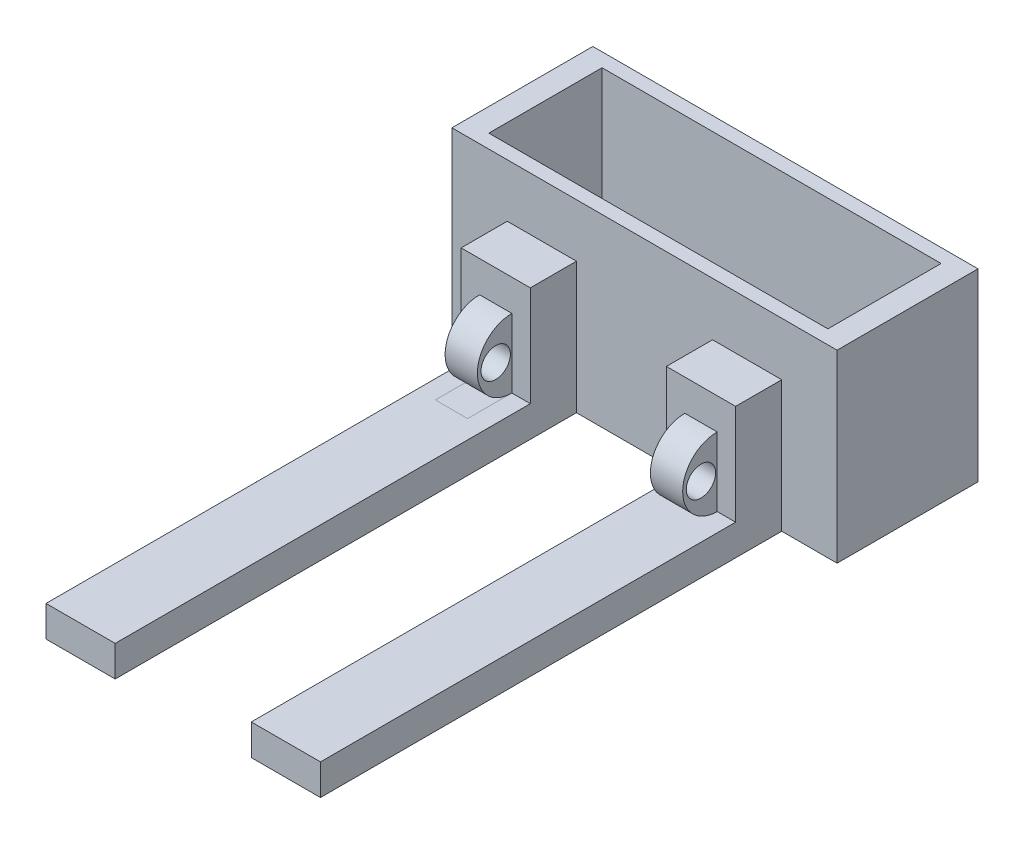
ISO-10303-21;
HEADER;
FILE_DESCRIPTION(('STEP AP214'),'2;1');
FILE_NAME('part.step','',(''),(''),'','','');
FILE_SCHEMA(('AUTOMOTIVE_DESIGN { 1 0 10303 214 1 1 1 1 }'));
ENDSEC;
DATA;
#1=APPLICATION_CONTEXT('core data for automotive mechanical design processes');
#2=APPLICATION_PROTOCOL_DEFINITION('international standard','automotive_design',2000,#1);
#3=PRODUCT_CONTEXT('',#1,'mechanical');
#4=PRODUCT('Part','Part','',(#3));
#5=PRODUCT_RELATED_PRODUCT_CATEGORY('part','',(#4));
#6=PRODUCT_DEFINITION_FORMATION('','',#4);
#7=PRODUCT_DEFINITION_CONTEXT('part definition',#1,'design');
#8=PRODUCT_DEFINITION('design','',#6,#7);
#9=PRODUCT_DEFINITION_SHAPE('','',#8);
#10=(LENGTH_UNIT() NAMED_UNIT(*) SI_UNIT(.MILLI.,.METRE.));
#11=(NAMED_UNIT(*) PLANE_ANGLE_UNIT() SI_UNIT($,.RADIAN.));
#12=(NAMED_UNIT(*) SI_UNIT($,.STERADIAN.) SOLID_ANGLE_UNIT());
#13=UNCERTAINTY_MEASURE_WITH_UNIT(LENGTH_MEASURE(1.E-05),#10,'distance_accuracy_value','');
#14=(GEOMETRIC_REPRESENTATION_CONTEXT(3) GLOBAL_UNCERTAINTY_ASSIGNED_CONTEXT((#13)) GLOBAL_UNIT_ASSIGNED_CONTEXT((#10,
#11,#12)) REPRESENTATION_CONTEXT('',''));
#15=CARTESIAN_POINT('',(0.,0.,0.));
#16=DIRECTION('',(0.,0.,1.));
#17=DIRECTION('',(1.,0.,0.));
#18=AXIS2_PLACEMENT_3D('',#15,#16,#17);
#19=CARTESIAN_POINT('',(23.814999995,-16.891,63.692000124));
#20=DIRECTION('',(1.,0.,0.));
#21=DIRECTION('',(0.,0.,-1.));
#22=AXIS2_PLACEMENT_3D('',#19,#20,#21);
#23=PLANE('',#22);
#24=CARTESIAN_POINT('',(23.814999995,-7.39730888162276,55.9588577245451));
#25=DIRECTION('',(1.,0.,0.));
#26=DIRECTION('',(0.,0.,-1.));
#27=AXIS2_PLACEMENT_3D('',#24,#25,#26);
#28=CIRCLE('',#27,4.04404322783224);
#29=CARTESIAN_POINT('',(23.814999995,-7.39730888162276,51.9148144967129));
#30=VERTEX_POINT('',#29);
#31=EDGE_CURVE('E847',#30,#30,#28,.T.);
#32=ORIENTED_EDGE('',*,*,#31,.T.);
#33=EDGE_LOOP('',(#32));
#34=FACE_BOUND('',#33,.T.);
#35=DIRECTION('',(0.,-1.,0.));
#36=VECTOR('',#35,1.);
#37=CARTESIAN_POINT('',(23.814999995,-16.891,51.500000124));
#38=LINE('',#37,#36);
#39=CARTESIAN_POINT('',(23.814999995,2.09638223675447,51.500000124));
#40=VERTEX_POINT('',#39);
#41=CARTESIAN_POINT('',(23.814999995,-16.891,51.500000124));
#42=VERTEX_POINT('',#41);
#43=EDGE_CURVE('E301',#40,#42,#38,.T.);
#44=ORIENTED_EDGE('',*,*,#43,.T.);
#45=CARTESIAN_POINT('',(23.814999995,-7.39730888162276,51.500000124));
#46=DIRECTION('',(1.,0.,0.));
#47=DIRECTION('',(0.,0.,-1.));
#48=AXIS2_PLACEMENT_3D('',#45,#46,#47);
#49=CIRCLE('',#48,9.49369111837724);
#50=EDGE_CURVE('E90',#42,#40,#49,.F.);
#51=ORIENTED_EDGE('',*,*,#50,.T.);
#52=EDGE_LOOP('',(#44,#51));
#53=FACE_BOUND('',#52,.T.);
#54=ADVANCED_FACE('F50',(#34,#53),#23,.F.);
#55=CARTESIAN_POINT('',(-32.704999995,-16.8927644735094,63.692000124));
#56=DIRECTION('',(1.,0.,0.));
#57=DIRECTION('',(0.,0.,-1.));
#58=AXIS2_PLACEMENT_3D('',#55,#56,#57);
#59=PLANE('',#58);
#60=CARTESIAN_POINT('',(-32.704999995,-7.39730888162276,55.9588577245451));
#61=DIRECTION('',(1.,0.,0.));
#62=DIRECTION('',(0.,0.,-1.));
#63=AXIS2_PLACEMENT_3D('',#60,#61,#62);
#64=CIRCLE('',#63,4.04404322783224);
#65=CARTESIAN_POINT('',(-32.704999995,-7.39730888162276,51.9148144967129));
#66=VERTEX_POINT('',#65);
#67=EDGE_CURVE('E846',#66,#66,#64,.T.);
#68=ORIENTED_EDGE('',*,*,#67,.T.);
#69=EDGE_LOOP('',(#68));
#70=FACE_BOUND('',#69,.T.);
#71=DIRECTION('',(0.,-1.,0.));
#72=VECTOR('',#71,1.);
#73=CARTESIAN_POINT('',(-32.704999995,-16.8927644735094,51.500000124));
#74=LINE('',#73,#72);
#75=CARTESIAN_POINT('',(-32.704999995,2.09638223675447,51.500000124));
#76=VERTEX_POINT('',#75);
#77=CARTESIAN_POINT('',(-32.704999995,-16.8918822367547,51.500000124));
#78=VERTEX_POINT('',#77);
#79=EDGE_CURVE('E366',#76,#78,#74,.T.);
#80=ORIENTED_EDGE('',*,*,#79,.T.);
#81=CARTESIAN_POINT('',(-32.704999995,-7.39730888162276,51.500000124));
#82=DIRECTION('',(1.,0.,0.));
#83=DIRECTION('',(0.,0.,-1.));
#84=AXIS2_PLACEMENT_3D('',#81,#82,#83);
#85=CIRCLE('',#84,9.49369111837724);
#86=EDGE_CURVE('E96',#78,#76,#85,.F.);
#87=ORIENTED_EDGE('',*,*,#86,.T.);
#88=EDGE_LOOP('',(#80,#87));
#89=FACE_BOUND('',#88,.T.);
#90=ADVANCED_FACE('F625',(#70,#89),#59,.F.);
#91=CARTESIAN_POINT('',(-23.814999995,-16.8927644735094,63.692000124));
#92=DIRECTION('',(-1.,0.,0.));
#93=DIRECTION('',(0.,0.,1.));
#94=AXIS2_PLACEMENT_3D('',#91,#92,#93);
#95=PLANE('',#94);
#96=CARTESIAN_POINT('',(-23.814999995,-7.39730888162276,55.9588577245451));
#97=DIRECTION('',(-1.,0.,0.));
#98=DIRECTION('',(0.,0.,1.));
#99=AXIS2_PLACEMENT_3D('',#96,#97,#98);
#100=CIRCLE('',#99,4.04404322783224);
#101=CARTESIAN_POINT('',(-23.814999995,-7.39730888162276,60.0029009523774));
#102=VERTEX_POINT('',#101);
#103=EDGE_CURVE('E848',#102,#102,#100,.T.);
#104=ORIENTED_EDGE('',*,*,#103,.T.);
#105=EDGE_LOOP('',(#104));
#106=FACE_BOUND('',#105,.T.);
#107=DIRECTION('',(0.,1.,0.));
#108=VECTOR('',#107,1.);
#109=CARTESIAN_POINT('',(-23.814999995,-16.8927644735094,51.500000124));
#110=LINE('',#109,#108);
#111=CARTESIAN_POINT('',(-23.814999995,-16.8918822367547,51.500000124));
#112=VERTEX_POINT('',#111);
#113=CARTESIAN_POINT('',(-23.814999995,2.09638223675447,51.500000124));
#114=VERTEX_POINT('',#113);
#115=EDGE_CURVE('E353',#112,#114,#110,.T.);
#116=ORIENTED_EDGE('',*,*,#115,.T.);
#117=CARTESIAN_POINT('',(-23.814999995,-7.39730888162276,51.500000124));
#118=DIRECTION('',(-1.,0.,0.));
#119=DIRECTION('',(0.,0.,1.));
#120=AXIS2_PLACEMENT_3D('',#117,#118,#119);
#121=CIRCLE('',#120,9.49369111837724);
#122=EDGE_CURVE('E11',#114,#112,#121,.F.);
#123=ORIENTED_EDGE('',*,*,#122,.T.);
#124=EDGE_LOOP('',(#116,#123));
#125=FACE_BOUND('',#124,.T.);
#126=ADVANCED_FACE('F319',(#106,#125),#95,.F.);
#127=CARTESIAN_POINT('',(-37.784999995,-16.8927644735094,165.800000124));
#128=DIRECTION('',(0.,-1.,0.));
#129=DIRECTION('',(0.,0.,-1.));
#130=AXIS2_PLACEMENT_3D('',#127,#128,#129);
#131=PLANE('',#130);
#132=CARTESIAN_POINT('',(-23.814999995,-16.891,63.692000124));
#133=DIRECTION('',(0.,0.,-1.));
#134=VECTOR('',#133,1.);
#135=LINE('',#132,#134);
#136=CARTESIAN_POINT('',(-23.814999995,-16.8918822367547,63.692000124));
#137=VERTEX_POINT('',#136);
#138=EDGE_CURVE('E337',#137,#112,#135,.T.);
#139=ORIENTED_EDGE('',*,*,#138,.F.);
#140=CARTESIAN_POINT('',(-32.704999995,-16.891,63.692000124));
#141=DIRECTION('',(1.,0.,0.));
#142=VECTOR('',#141,1.);
#143=LINE('',#140,#142);
#144=CARTESIAN_POINT('',(-32.704999995,-16.8918822367547,63.692000124));
#145=VERTEX_POINT('',#144);
#146=EDGE_CURVE('E351',#145,#137,#143,.T.);
#147=ORIENTED_EDGE('',*,*,#146,.F.);
#148=CARTESIAN_POINT('',(-32.704999995,-16.8927644735094,63.692000124));
#149=DIRECTION('',(0.,0.,-1.));
#150=VECTOR('',#149,1.);
#151=LINE('',#148,#150);
#152=EDGE_CURVE('E257',#145,#78,#151,.T.);
#153=ORIENTED_EDGE('',*,*,#152,.T.);
#154=DIRECTION('',(1.,0.,0.));
#155=VECTOR('',#154,1.);
#156=CARTESIAN_POINT('',(-37.784999995,-16.8927644735094,51.500000124));
#157=LINE('',#156,#155);
#158=CARTESIAN_POINT('',(-37.784999995,-16.8927644735094,51.500000124));
#159=VERTEX_POINT('',#158);
#160=EDGE_CURVE('E371',#78,#159,#157,.F.);
#161=ORIENTED_EDGE('',*,*,#160,.T.);
#162=DIRECTION('',(0.,0.,-1.));
#163=VECTOR('',#162,1.);
#164=CARTESIAN_POINT('',(-37.784999995,-16.8927644735094,165.800000124));
#165=LINE('',#164,#163);
#166=CARTESIAN_POINT('',(-37.784999995,-16.8927644735094,165.800000124));
#167=VERTEX_POINT('',#166);
#168=EDGE_CURVE('E285',#167,#159,#165,.T.);
#169=ORIENTED_EDGE('',*,*,#168,.F.);
#170=DIRECTION('',(-1.,0.,0.));
#171=VECTOR('',#170,1.);
#172=CARTESIAN_POINT('',(-37.784999995,-16.8927644735094,165.800000124));
#173=LINE('',#172,#171);
#174=CARTESIAN_POINT('',(-18.734999995,-16.8927644735094,165.800000124));
#175=VERTEX_POINT('',#174);
#176=EDGE_CURVE('E278',#175,#167,#173,.T.);
#177=ORIENTED_EDGE('',*,*,#176,.F.);
#178=DIRECTION('',(0.,0.,-1.));
#179=VECTOR('',#178,1.);
#180=CARTESIAN_POINT('',(-18.734999995,-16.8927644735094,165.800000124));
#181=LINE('',#180,#179);
#182=CARTESIAN_POINT('',(-18.734999995,-16.8927644735094,51.500000124));
#183=VERTEX_POINT('',#182);
#184=EDGE_CURVE('E395',#175,#183,#181,.T.);
#185=ORIENTED_EDGE('',*,*,#184,.T.);
#186=DIRECTION('',(1.,0.,0.));
#187=VECTOR('',#186,1.);
#188=CARTESIAN_POINT('',(-37.784999995,-16.8927644735094,51.500000124));
#189=LINE('',#188,#187);
#190=EDGE_CURVE('E275',#183,#112,#189,.F.);
#191=ORIENTED_EDGE('',*,*,#190,.T.);
#192=EDGE_LOOP('',(#139,#147,#153,#161,#169,#177,#185,#191));
#193=FACE_BOUND('',#192,.T.);
#194=ADVANCED_FACE('F423',(#193),#131,.F.);
#195=CARTESIAN_POINT('',(18.734999995,-16.891,165.800000124));
#196=DIRECTION('',(0.,-1.,0.));
#197=DIRECTION('',(0.,0.,-1.));
#198=AXIS2_PLACEMENT_3D('',#195,#196,#197);
#199=PLANE('',#198);
#200=DIRECTION('',(-1.,0.,0.));
#201=VECTOR('',#200,1.);
#202=CARTESIAN_POINT('',(18.734999995,-16.891,51.500000124));
#203=LINE('',#202,#201);
#204=CARTESIAN_POINT('',(37.784999995,-16.891,51.500000124));
#205=VERTEX_POINT('',#204);
#206=CARTESIAN_POINT('',(32.704999995,-16.891,51.500000124));
#207=VERTEX_POINT('',#206);
#208=EDGE_CURVE('E380',#205,#207,#203,.T.);
#209=ORIENTED_EDGE('',*,*,#208,.T.);
#210=DIRECTION('',(1.,0.,0.));
#211=VECTOR('',#210,1.);
#212=CARTESIAN_POINT('',(-45.527000005,-16.891,51.500000124));
#213=LINE('',#212,#211);
#214=EDGE_CURVE('E51',#42,#207,#213,.T.);
#215=ORIENTED_EDGE('',*,*,#214,.F.);
#216=CARTESIAN_POINT('',(18.734999995,-16.891,51.500000124));
#217=VERTEX_POINT('',#216);
#218=EDGE_CURVE('E286',#42,#217,#203,.T.);
#219=ORIENTED_EDGE('',*,*,#218,.T.);
#220=DIRECTION('',(0.,0.,-1.));
#221=VECTOR('',#220,1.);
#222=CARTESIAN_POINT('',(18.734999995,-16.891,165.800000124));
#223=LINE('',#222,#221);
#224=CARTESIAN_POINT('',(18.734999995,-16.891,165.800000124));
#225=VERTEX_POINT('',#224);
#226=EDGE_CURVE('E287',#225,#217,#223,.T.);
#227=ORIENTED_EDGE('',*,*,#226,.F.);
#228=DIRECTION('',(-1.,0.,0.));
#229=VECTOR('',#228,1.);
#230=CARTESIAN_POINT('',(18.734999995,-16.891,165.800000124));
#231=LINE('',#230,#229);
#232=CARTESIAN_POINT('',(37.784999995,-16.891,165.800000124));
#233=VERTEX_POINT('',#232);
#234=EDGE_CURVE('E294',#233,#225,#231,.T.);
#235=ORIENTED_EDGE('',*,*,#234,.F.);
#236=DIRECTION('',(0.,0.,-1.));
#237=VECTOR('',#236,1.);
#238=CARTESIAN_POINT('',(37.784999995,-16.891,165.800000124));
#239=LINE('',#238,#237);
#240=EDGE_CURVE('E236',#233,#205,#239,.T.);
#241=ORIENTED_EDGE('',*,*,#240,.T.);
#242=EDGE_LOOP('',(#209,#215,#219,#227,#235,#241));
#243=FACE_BOUND('',#242,.T.);
#244=ADVANCED_FACE('F431',(#243),#199,.F.);
#245=CARTESIAN_POINT('',(53.024999995,25.4,38.800000124));
#246=DIRECTION('',(-1.,0.,0.));
#247=DIRECTION('',(0.,-1.,0.));
#248=AXIS2_PLACEMENT_3D('',#245,#246,#247);
#249=PLANE('',#248);
#250=DIRECTION('',(0.,1.,0.));
#251=VECTOR('',#250,1.);
#252=CARTESIAN_POINT('',(53.024999995,25.4,0.));
#253=LINE('',#252,#251);
#254=CARTESIAN_POINT('',(53.024999995,-25.4,0.));
#255=VERTEX_POINT('',#254);
#256=CARTESIAN_POINT('',(53.024999995,25.4,0.));
#257=VERTEX_POINT('',#256);
#258=EDGE_CURVE('E508',#255,#257,#253,.T.);
#259=ORIENTED_EDGE('',*,*,#258,.T.);
#260=DIRECTION('',(0.,0.,-1.));
#261=VECTOR('',#260,1.);
#262=CARTESIAN_POINT('',(53.024999995,25.4,38.800000124));
#263=LINE('',#262,#261);
#264=CARTESIAN_POINT('',(53.024999995,25.4,38.800000124));
#265=VERTEX_POINT('',#264);
#266=EDGE_CURVE('E484',#265,#257,#263,.T.);
#267=ORIENTED_EDGE('',*,*,#266,.F.);
#268=DIRECTION('',(0.,1.,0.));
#269=VECTOR('',#268,1.);
#270=CARTESIAN_POINT('',(53.024999995,25.4,38.800000124));
#271=LINE('',#270,#269);
#272=CARTESIAN_POINT('',(53.024999995,-25.4,38.800000124));
#273=VERTEX_POINT('',#272);
#274=EDGE_CURVE('E505',#273,#265,#271,.T.);
#275=ORIENTED_EDGE('',*,*,#274,.F.);
#276=DIRECTION('',(0.,0.,-1.));
#277=VECTOR('',#276,1.);
#278=CARTESIAN_POINT('',(53.024999995,-25.4,38.800000124));
#279=LINE('',#278,#277);
#280=EDGE_CURVE('E494',#273,#255,#279,.T.);
#281=ORIENTED_EDGE('',*,*,#280,.T.);
#282=EDGE_LOOP('',(#259,#267,#275,#281));
#283=FACE_BOUND('',#282,.T.);
#284=ADVANCED_FACE('F47',(#283),#249,.F.);
#285=CARTESIAN_POINT('',(-53.024999995,25.4,38.800000124));
#286=DIRECTION('',(0.,-1.,0.));
#287=DIRECTION('',(0.,0.,-1.));
#288=AXIS2_PLACEMENT_3D('',#285,#286,#287);
#289=PLANE('',#288);
#290=DIRECTION('',(-1.,0.,0.));
#291=VECTOR('',#290,1.);
#292=CARTESIAN_POINT('',(46.674999995,25.4,3.81));
#293=LINE('',#292,#291);
#294=CARTESIAN_POINT('',(46.674999995,25.4,3.81));
#295=VERTEX_POINT('',#294);
#296=CARTESIAN_POINT('',(-46.674999995,25.4,3.81000000000001));
#297=VERTEX_POINT('',#296);
#298=EDGE_CURVE('E549',#295,#297,#293,.T.);
#299=ORIENTED_EDGE('',*,*,#298,.F.);
#300=DIRECTION('',(0.,0.,-1.));
#301=VECTOR('',#300,1.);
#302=CARTESIAN_POINT('',(46.674999995,25.4,34.990000124));
#303=LINE('',#302,#301);
#304=CARTESIAN_POINT('',(46.674999995,25.4,34.990000124));
#305=VERTEX_POINT('',#304);
#306=EDGE_CURVE('E553',#305,#295,#303,.T.);
#307=ORIENTED_EDGE('',*,*,#306,.F.);
#308=DIRECTION('',(1.,0.,0.));
#309=VECTOR('',#308,1.);
#310=CARTESIAN_POINT('',(-46.674999995,25.4,34.990000124));
#311=LINE('',#310,#309);
#312=CARTESIAN_POINT('',(-46.674999995,25.4,34.990000124));
#313=VERTEX_POINT('',#312);
#314=EDGE_CURVE('E535',#313,#305,#311,.T.);
#315=ORIENTED_EDGE('',*,*,#314,.F.);
#316=DIRECTION('',(0.,0.,1.));
#317=VECTOR('',#316,1.);
#318=CARTESIAN_POINT('',(-46.674999995,25.4,3.81000000000001));
#319=LINE('',#318,#317);
#320=EDGE_CURVE('E541',#297,#313,#319,.T.);
#321=ORIENTED_EDGE('',*,*,#320,.F.);
#322=EDGE_LOOP('',(#299,#307,#315,#321));
#323=FACE_BOUND('',#322,.T.);
#324=DIRECTION('',(-1.,0.,0.));
#325=VECTOR('',#324,1.);
#326=CARTESIAN_POINT('',(-53.024999995,25.4,0.));
#327=LINE('',#326,#325);
#328=CARTESIAN_POINT('',(-53.024999995,25.4,0.));
#329=VERTEX_POINT('',#328);
#330=EDGE_CURVE('E506',#257,#329,#327,.T.);
#331=ORIENTED_EDGE('',*,*,#330,.T.);
#332=DIRECTION('',(0.,0.,-1.));
#333=VECTOR('',#332,1.);
#334=CARTESIAN_POINT('',(-53.024999995,25.4,38.800000124));
#335=LINE('',#334,#333);
#336=CARTESIAN_POINT('',(-53.024999995,25.4,38.800000124));
#337=VERTEX_POINT('',#336);
#338=EDGE_CURVE('E488',#337,#329,#335,.T.);
#339=ORIENTED_EDGE('',*,*,#338,.F.);
#340=DIRECTION('',(-1.,0.,0.));
#341=VECTOR('',#340,1.);
#342=CARTESIAN_POINT('',(-53.024999995,25.4,38.800000124));
#343=LINE('',#342,#341);
#344=EDGE_CURVE('E523',#265,#337,#343,.T.);
#345=ORIENTED_EDGE('',*,*,#344,.F.);
#346=ORIENTED_EDGE('',*,*,#266,.T.);
#347=EDGE_LOOP('',(#331,#339,#345,#346));
#348=FACE_BOUND('',#347,.T.);
#349=ADVANCED_FACE('F656',(#323,#348),#289,.F.);
#350=CARTESIAN_POINT('',(-53.024999995,25.4,38.800000124));
#351=DIRECTION('',(1.,0.,0.));
#352=DIRECTION('',(0.,0.,-1.));
#353=AXIS2_PLACEMENT_3D('',#350,#351,#352);
#354=PLANE('',#353);
#355=DIRECTION('',(0.,-1.,0.));
#356=VECTOR('',#355,1.);
#357=CARTESIAN_POINT('',(-53.024999995,25.4,0.));
#358=LINE('',#357,#356);
#359=CARTESIAN_POINT('',(-53.024999995,-25.4,0.));
#360=VERTEX_POINT('',#359);
#361=EDGE_CURVE('E503',#329,#360,#358,.T.);
#362=ORIENTED_EDGE('',*,*,#361,.T.);
#363=DIRECTION('',(0.,0.,-1.));
#364=VECTOR('',#363,1.);
#365=CARTESIAN_POINT('',(-53.024999995,-25.4,38.800000124));
#366=LINE('',#365,#364);
#367=CARTESIAN_POINT('',(-53.024999995,-25.4,38.800000124));
#368=VERTEX_POINT('',#367);
#369=EDGE_CURVE('E489',#368,#360,#366,.T.);
#370=ORIENTED_EDGE('',*,*,#369,.F.);
#371=DIRECTION('',(0.,-1.,0.));
#372=VECTOR('',#371,1.);
#373=CARTESIAN_POINT('',(-53.024999995,25.4,38.800000124));
#374=LINE('',#373,#372);
#375=EDGE_CURVE('E520',#337,#368,#374,.T.);
#376=ORIENTED_EDGE('',*,*,#375,.F.);
#377=ORIENTED_EDGE('',*,*,#338,.T.);
#378=EDGE_LOOP('',(#362,#370,#376,#377));
#379=FACE_BOUND('',#378,.T.);
#380=ADVANCED_FACE('F663',(#379),#354,.F.);
#381=CARTESIAN_POINT('',(-53.024999995,-25.4,38.800000124));
#382=DIRECTION('',(0.,1.,0.));
#383=DIRECTION('',(0.,0.,1.));
#384=AXIS2_PLACEMENT_3D('',#381,#382,#383);
#385=PLANE('',#384);
#386=DIRECTION('',(1.,0.,0.));
#387=VECTOR('',#386,1.);
#388=CARTESIAN_POINT('',(-53.024999995,-25.4,34.990000124));
#389=LINE('',#388,#387);
#390=CARTESIAN_POINT('',(-46.674999995,-25.4,34.990000124));
#391=VERTEX_POINT('',#390);
#392=CARTESIAN_POINT('',(46.674999995,-25.4,34.990000124));
#393=VERTEX_POINT('',#392);
#394=EDGE_CURVE('E468',#391,#393,#389,.T.);
#395=ORIENTED_EDGE('',*,*,#394,.T.);
#396=DIRECTION('',(0.,0.,-1.));
#397=VECTOR('',#396,1.);
#398=CARTESIAN_POINT('',(46.674999995,-25.4,38.800000124));
#399=LINE('',#398,#397);
#400=CARTESIAN_POINT('',(46.674999995,-25.4,3.81));
#401=VERTEX_POINT('',#400);
#402=EDGE_CURVE('E59',#393,#401,#399,.T.);
#403=ORIENTED_EDGE('',*,*,#402,.T.);
#404=DIRECTION('',(-1.,0.,0.));
#405=VECTOR('',#404,1.);
#406=CARTESIAN_POINT('',(-53.024999995,-25.4,3.81000000000001));
#407=LINE('',#406,#405);
#408=CARTESIAN_POINT('',(-46.674999995,-25.4,3.81000000000001));
#409=VERTEX_POINT('',#408);
#410=EDGE_CURVE('E476',#401,#409,#407,.T.);
#411=ORIENTED_EDGE('',*,*,#410,.T.);
#412=DIRECTION('',(0.,0.,1.));
#413=VECTOR('',#412,1.);
#414=CARTESIAN_POINT('',(-46.674999995,-25.4,38.800000124));
#415=LINE('',#414,#413);
#416=EDGE_CURVE('E473',#409,#391,#415,.T.);
#417=ORIENTED_EDGE('',*,*,#416,.T.);
#418=EDGE_LOOP('',(#395,#403,#411,#417));
#419=FACE_BOUND('',#418,.T.);
#420=DIRECTION('',(1.,0.,0.));
#421=VECTOR('',#420,1.);
#422=CARTESIAN_POINT('',(-53.024999995,-25.4,0.));
#423=LINE('',#422,#421);
#424=EDGE_CURVE('E497',#360,#255,#423,.T.);
#425=ORIENTED_EDGE('',*,*,#424,.T.);
#426=ORIENTED_EDGE('',*,*,#280,.F.);
#427=DIRECTION('',(1.,0.,0.));
#428=VECTOR('',#427,1.);
#429=CARTESIAN_POINT('',(-53.024999995,-25.4,38.800000124));
#430=LINE('',#429,#428);
#431=CARTESIAN_POINT('',(37.784999995,-25.4,38.800000124));
#432=VERTEX_POINT('',#431);
#433=EDGE_CURVE('E516',#432,#273,#430,.T.);
#434=ORIENTED_EDGE('',*,*,#433,.F.);
#435=DIRECTION('',(0.,0.,-1.));
#436=VECTOR('',#435,1.);
#437=CARTESIAN_POINT('',(37.784999995,-25.4,51.500000124));
#438=LINE('',#437,#436);
#439=CARTESIAN_POINT('',(37.784999995,-25.4,165.800000124));
#440=VERTEX_POINT('',#439);
#441=EDGE_CURVE('E560',#440,#432,#438,.T.);
#442=ORIENTED_EDGE('',*,*,#441,.F.);
#443=DIRECTION('',(1.,0.,0.));
#444=VECTOR('',#443,1.);
#445=CARTESIAN_POINT('',(18.734999995,-25.4,165.800000124));
#446=LINE('',#445,#444);
#447=CARTESIAN_POINT('',(18.734999995,-25.4,165.800000124));
#448=VERTEX_POINT('',#447);
#449=EDGE_CURVE('E579',#448,#440,#446,.T.);
#450=ORIENTED_EDGE('',*,*,#449,.F.);
#451=DIRECTION('',(0.,0.,-1.));
#452=VECTOR('',#451,1.);
#453=CARTESIAN_POINT('',(18.734999995,-25.4,51.500000124));
#454=LINE('',#453,#452);
#455=CARTESIAN_POINT('',(18.734999995,-25.4,38.800000124));
#456=VERTEX_POINT('',#455);
#457=EDGE_CURVE('E223',#448,#456,#454,.T.);
#458=ORIENTED_EDGE('',*,*,#457,.T.);
#459=CARTESIAN_POINT('',(-18.734999995,-25.4,38.800000124));
#460=VERTEX_POINT('',#459);
#461=EDGE_CURVE('E519',#460,#456,#430,.T.);
#462=ORIENTED_EDGE('',*,*,#461,.F.);
#463=DIRECTION('',(0.,0.,-1.));
#464=VECTOR('',#463,1.);
#465=CARTESIAN_POINT('',(-18.734999995,-25.4,51.500000124));
#466=LINE('',#465,#464);
#467=CARTESIAN_POINT('',(-18.734999995,-25.4,165.800000124));
#468=VERTEX_POINT('',#467);
#469=EDGE_CURVE('E216',#468,#460,#466,.T.);
#470=ORIENTED_EDGE('',*,*,#469,.F.);
#471=DIRECTION('',(1.,0.,0.));
#472=VECTOR('',#471,1.);
#473=CARTESIAN_POINT('',(-37.784999995,-25.4,165.800000124));
#474=LINE('',#473,#472);
#475=CARTESIAN_POINT('',(-37.784999995,-25.4,165.800000124));
#476=VERTEX_POINT('',#475);
#477=EDGE_CURVE('E272',#476,#468,#474,.T.);
#478=ORIENTED_EDGE('',*,*,#477,.F.);
#479=DIRECTION('',(0.,0.,-1.));
#480=VECTOR('',#479,1.);
#481=CARTESIAN_POINT('',(-37.784999995,-25.4,51.500000124));
#482=LINE('',#481,#480);
#483=CARTESIAN_POINT('',(-37.784999995,-25.4,38.800000124));
#484=VERTEX_POINT('',#483);
#485=EDGE_CURVE('E555',#476,#484,#482,.T.);
#486=ORIENTED_EDGE('',*,*,#485,.T.);
#487=EDGE_CURVE('E498',#368,#484,#430,.T.);
#488=ORIENTED_EDGE('',*,*,#487,.F.);
#489=ORIENTED_EDGE('',*,*,#369,.T.);
#490=EDGE_LOOP('',(#425,#426,#434,#442,#450,#458,#462,#470,#478,#486,#488,#489));
#491=FACE_BOUND('',#490,.T.);
#492=ADVANCED_FACE('F601',(#419,#491),#385,.F.);
#493=CARTESIAN_POINT('',(0.,0.,38.800000124));
#494=DIRECTION('',(0.,0.,1.));
#495=DIRECTION('',(1.,0.,0.));
#496=AXIS2_PLACEMENT_3D('',#493,#494,#495);
#497=PLANE('',#496);
#498=DIRECTION('',(0.,1.,0.));
#499=VECTOR('',#498,1.);
#500=CARTESIAN_POINT('',(-37.784999995,0.,38.800000124));
#501=LINE('',#500,#499);
#502=CARTESIAN_POINT('',(-37.784999995,10.7334770521839,38.800000124));
#503=VERTEX_POINT('',#502);
#504=EDGE_CURVE('E221',#484,#503,#501,.T.);
#505=ORIENTED_EDGE('',*,*,#504,.T.);
#506=DIRECTION('',(-1.,0.,0.));
#507=VECTOR('',#506,1.);
#508=CARTESIAN_POINT('',(-37.784999995,10.7334770521839,38.800000124));
#509=LINE('',#508,#507);
#510=CARTESIAN_POINT('',(-18.734999995,10.7334770521839,38.800000124));
#511=VERTEX_POINT('',#510);
#512=EDGE_CURVE('E233',#511,#503,#509,.T.);
#513=ORIENTED_EDGE('',*,*,#512,.F.);
#514=DIRECTION('',(0.,1.,0.));
#515=VECTOR('',#514,1.);
#516=CARTESIAN_POINT('',(-18.734999995,0.,38.800000124));
#517=LINE('',#516,#515);
#518=EDGE_CURVE('E214',#460,#511,#517,.T.);
#519=ORIENTED_EDGE('',*,*,#518,.F.);
#520=ORIENTED_EDGE('',*,*,#461,.T.);
#521=DIRECTION('',(0.,1.,0.));
#522=VECTOR('',#521,1.);
#523=CARTESIAN_POINT('',(18.734999995,0.,38.800000124));
#524=LINE('',#523,#522);
#525=CARTESIAN_POINT('',(18.734999995,10.7334770521839,38.800000124));
#526=VERTEX_POINT('',#525);
#527=EDGE_CURVE('E401',#456,#526,#524,.T.);
#528=ORIENTED_EDGE('',*,*,#527,.T.);
#529=DIRECTION('',(-1.,0.,0.));
#530=VECTOR('',#529,1.);
#531=CARTESIAN_POINT('',(18.734999995,10.7334770521839,38.800000124));
#532=LINE('',#531,#530);
#533=CARTESIAN_POINT('',(37.784999995,10.7334770521839,38.800000124));
#534=VERTEX_POINT('',#533);
#535=EDGE_CURVE('E243',#534,#526,#532,.T.);
#536=ORIENTED_EDGE('',*,*,#535,.F.);
#537=DIRECTION('',(0.,1.,0.));
#538=VECTOR('',#537,1.);
#539=CARTESIAN_POINT('',(37.784999995,0.,38.800000124));
#540=LINE('',#539,#538);
#541=EDGE_CURVE('E392',#432,#534,#540,.T.);
#542=ORIENTED_EDGE('',*,*,#541,.F.);
#543=ORIENTED_EDGE('',*,*,#433,.T.);
#544=ORIENTED_EDGE('',*,*,#274,.T.);
#545=ORIENTED_EDGE('',*,*,#344,.T.);
#546=ORIENTED_EDGE('',*,*,#375,.T.);
#547=ORIENTED_EDGE('',*,*,#487,.T.);
#548=EDGE_LOOP('',(#505,#513,#519,#520,#528,#536,#542,#543,#544,#545,#546,#547));
#549=FACE_BOUND('',#548,.T.);
#550=ADVANCED_FACE('F237',(#549),#497,.T.);
#551=CARTESIAN_POINT('',(0.,0.,0.));
#552=DIRECTION('',(0.,0.,1.));
#553=DIRECTION('',(1.,0.,0.));
#554=AXIS2_PLACEMENT_3D('',#551,#552,#553);
#555=PLANE('',#554);
#556=ORIENTED_EDGE('',*,*,#258,.F.);
#557=ORIENTED_EDGE('',*,*,#424,.F.);
#558=ORIENTED_EDGE('',*,*,#361,.F.);
#559=ORIENTED_EDGE('',*,*,#330,.F.);
#560=EDGE_LOOP('',(#556,#557,#558,#559));
#561=FACE_BOUND('',#560,.T.);
#562=ADVANCED_FACE('F704',(#561),#555,.F.);
#563=CARTESIAN_POINT('',(46.674999995,-39.116,34.990000124));
#564=DIRECTION('',(1.,0.,0.));
#565=DIRECTION('',(0.,0.,-1.));
#566=AXIS2_PLACEMENT_3D('',#563,#564,#565);
#567=PLANE('',#566);
#568=DIRECTION('',(0.,1.,0.));
#569=VECTOR('',#568,1.);
#570=CARTESIAN_POINT('',(46.674999995,-39.116,34.990000124));
#571=LINE('',#570,#569);
#572=EDGE_CURVE('E514',#393,#305,#571,.T.);
#573=ORIENTED_EDGE('',*,*,#572,.T.);
#574=ORIENTED_EDGE('',*,*,#306,.T.);
#575=DIRECTION('',(0.,1.,0.));
#576=VECTOR('',#575,1.);
#577=CARTESIAN_POINT('',(46.674999995,-39.116,3.81));
#578=LINE('',#577,#576);
#579=EDGE_CURVE('E529',#401,#295,#578,.T.);
#580=ORIENTED_EDGE('',*,*,#579,.F.);
#581=ORIENTED_EDGE('',*,*,#402,.F.);
#582=EDGE_LOOP('',(#573,#574,#580,#581));
#583=FACE_BOUND('',#582,.T.);
#584=ADVANCED_FACE('F694',(#583),#567,.F.);
#585=CARTESIAN_POINT('',(-46.674999995,-39.116,34.990000124));
#586=DIRECTION('',(0.,0.,1.));
#587=DIRECTION('',(1.,0.,0.));
#588=AXIS2_PLACEMENT_3D('',#585,#586,#587);
#589=PLANE('',#588);
#590=DIRECTION('',(0.,1.,0.));
#591=VECTOR('',#590,1.);
#592=CARTESIAN_POINT('',(-46.674999995,-39.116,34.990000124));
#593=LINE('',#592,#591);
#594=EDGE_CURVE('E533',#391,#313,#593,.T.);
#595=ORIENTED_EDGE('',*,*,#594,.T.);
#596=ORIENTED_EDGE('',*,*,#314,.T.);
#597=ORIENTED_EDGE('',*,*,#572,.F.);
#598=ORIENTED_EDGE('',*,*,#394,.F.);
#599=EDGE_LOOP('',(#595,#596,#597,#598));
#600=FACE_BOUND('',#599,.T.);
#601=ADVANCED_FACE('F691',(#600),#589,.F.);
#602=CARTESIAN_POINT('',(-46.674999995,-39.116,3.81000000000001));
#603=DIRECTION('',(-1.,0.,0.));
#604=DIRECTION('',(0.,0.,1.));
#605=AXIS2_PLACEMENT_3D('',#602,#603,#604);
#606=PLANE('',#605);
#607=DIRECTION('',(0.,1.,0.));
#608=VECTOR('',#607,1.);
#609=CARTESIAN_POINT('',(-46.674999995,-39.116,3.81000000000001));
#610=LINE('',#609,#608);
#611=EDGE_CURVE('E532',#409,#297,#610,.T.);
#612=ORIENTED_EDGE('',*,*,#611,.T.);
#613=ORIENTED_EDGE('',*,*,#320,.T.);
#614=ORIENTED_EDGE('',*,*,#594,.F.);
#615=ORIENTED_EDGE('',*,*,#416,.F.);
#616=EDGE_LOOP('',(#612,#613,#614,#615));
#617=FACE_BOUND('',#616,.T.);
#618=ADVANCED_FACE('F692',(#617),#606,.F.);
#619=CARTESIAN_POINT('',(46.674999995,-39.116,3.81));
#620=DIRECTION('',(0.,0.,-1.));
#621=DIRECTION('',(-1.,0.,0.));
#622=AXIS2_PLACEMENT_3D('',#619,#620,#621);
#623=PLANE('',#622);
#624=ORIENTED_EDGE('',*,*,#579,.T.);
#625=ORIENTED_EDGE('',*,*,#298,.T.);
#626=ORIENTED_EDGE('',*,*,#611,.F.);
#627=ORIENTED_EDGE('',*,*,#410,.F.);
#628=EDGE_LOOP('',(#624,#625,#626,#627));
#629=FACE_BOUND('',#628,.T.);
#630=ADVANCED_FACE('F687',(#629),#623,.F.);
#631=CARTESIAN_POINT('',(37.784999995,0.,51.500000124));
#632=DIRECTION('',(-1.,0.,0.));
#633=DIRECTION('',(0.,0.,1.));
#634=AXIS2_PLACEMENT_3D('',#631,#632,#633);
#635=PLANE('',#634);
#636=ORIENTED_EDGE('',*,*,#541,.T.);
#637=DIRECTION('',(0.,0.,-1.));
#638=VECTOR('',#637,1.);
#639=CARTESIAN_POINT('',(37.784999995,10.7334770521839,51.500000124));
#640=LINE('',#639,#638);
#641=CARTESIAN_POINT('',(37.784999995,10.7334770521839,51.500000124));
#642=VERTEX_POINT('',#641);
#643=EDGE_CURVE('E253',#642,#534,#640,.T.);
#644=ORIENTED_EDGE('',*,*,#643,.F.);
#645=DIRECTION('',(0.,1.,0.));
#646=VECTOR('',#645,1.);
#647=CARTESIAN_POINT('',(37.784999995,0.,51.500000124));
#648=LINE('',#647,#646);
#649=EDGE_CURVE('E565',#205,#642,#648,.T.);
#650=ORIENTED_EDGE('',*,*,#649,.F.);
#651=ORIENTED_EDGE('',*,*,#240,.F.);
#652=DIRECTION('',(0.,1.,0.));
#653=VECTOR('',#652,1.);
#654=CARTESIAN_POINT('',(37.784999995,-25.4,165.800000124));
#655=LINE('',#654,#653);
#656=EDGE_CURVE('E581',#440,#233,#655,.T.);
#657=ORIENTED_EDGE('',*,*,#656,.F.);
#658=ORIENTED_EDGE('',*,*,#441,.T.);
#659=EDGE_LOOP('',(#636,#644,#650,#651,#657,#658));
#660=FACE_BOUND('',#659,.T.);
#661=ADVANCED_FACE('F602',(#660),#635,.F.);
#662=CARTESIAN_POINT('',(18.734999995,0.,51.500000124));
#663=DIRECTION('',(-1.,0.,0.));
#664=DIRECTION('',(0.,0.,1.));
#665=AXIS2_PLACEMENT_3D('',#662,#663,#664);
#666=PLANE('',#665);
#667=ORIENTED_EDGE('',*,*,#527,.F.);
#668=ORIENTED_EDGE('',*,*,#457,.F.);
#669=DIRECTION('',(0.,-1.,0.));
#670=VECTOR('',#669,1.);
#671=CARTESIAN_POINT('',(18.734999995,-25.4,165.800000124));
#672=LINE('',#671,#670);
#673=EDGE_CURVE('E573',#225,#448,#672,.T.);
#674=ORIENTED_EDGE('',*,*,#673,.F.);
#675=ORIENTED_EDGE('',*,*,#226,.T.);
#676=DIRECTION('',(0.,1.,0.));
#677=VECTOR('',#676,1.);
#678=CARTESIAN_POINT('',(18.734999995,0.,51.500000124));
#679=LINE('',#678,#677);
#680=CARTESIAN_POINT('',(18.734999995,10.7334770521839,51.500000124));
#681=VERTEX_POINT('',#680);
#682=EDGE_CURVE('E557',#217,#681,#679,.T.);
#683=ORIENTED_EDGE('',*,*,#682,.T.);
#684=DIRECTION('',(0.,0.,-1.));
#685=VECTOR('',#684,1.);
#686=CARTESIAN_POINT('',(18.734999995,10.7334770521839,51.500000124));
#687=LINE('',#686,#685);
#688=EDGE_CURVE('E258',#681,#526,#687,.T.);
#689=ORIENTED_EDGE('',*,*,#688,.T.);
#690=EDGE_LOOP('',(#667,#668,#674,#675,#683,#689));
#691=FACE_BOUND('',#690,.T.);
#692=ADVANCED_FACE('F599',(#691),#666,.T.);
#693=CARTESIAN_POINT('',(0.,0.,51.500000124));
#694=DIRECTION('',(0.,0.,1.));
#695=DIRECTION('',(1.,0.,0.));
#696=AXIS2_PLACEMENT_3D('',#693,#694,#695);
#697=PLANE('',#696);
#698=ORIENTED_EDGE('',*,*,#43,.F.);
#699=DIRECTION('',(-1.,0.,0.));
#700=VECTOR('',#699,1.);
#701=CARTESIAN_POINT('',(23.814999995,2.09638223675447,51.500000124));
#702=LINE('',#701,#700);
#703=CARTESIAN_POINT('',(32.704999995,2.09638223675447,51.500000124));
#704=VERTEX_POINT('',#703);
#705=EDGE_CURVE('E70',#704,#40,#702,.T.);
#706=ORIENTED_EDGE('',*,*,#705,.F.);
#707=DIRECTION('',(0.,1.,0.));
#708=VECTOR('',#707,1.);
#709=CARTESIAN_POINT('',(32.704999995,-16.891,51.500000124));
#710=LINE('',#709,#708);
#711=EDGE_CURVE('E357',#207,#704,#710,.T.);
#712=ORIENTED_EDGE('',*,*,#711,.F.);
#713=ORIENTED_EDGE('',*,*,#208,.F.);
#714=ORIENTED_EDGE('',*,*,#649,.T.);
#715=DIRECTION('',(-1.,0.,0.));
#716=VECTOR('',#715,1.);
#717=CARTESIAN_POINT('',(18.734999995,10.7334770521839,51.500000124));
#718=LINE('',#717,#716);
#719=EDGE_CURVE('E248',#642,#681,#718,.T.);
#720=ORIENTED_EDGE('',*,*,#719,.T.);
#721=ORIENTED_EDGE('',*,*,#682,.F.);
#722=ORIENTED_EDGE('',*,*,#218,.F.);
#723=EDGE_LOOP('',(#698,#706,#712,#713,#714,#720,#721,#722));
#724=FACE_BOUND('',#723,.T.);
#725=ADVANCED_FACE('F615',(#724),#697,.T.);
#726=CARTESIAN_POINT('',(-18.734999995,0.,51.500000124));
#727=DIRECTION('',(-1.,0.,0.));
#728=DIRECTION('',(0.,0.,1.));
#729=AXIS2_PLACEMENT_3D('',#726,#727,#728);
#730=PLANE('',#729);
#731=ORIENTED_EDGE('',*,*,#518,.T.);
#732=DIRECTION('',(0.,0.,-1.));
#733=VECTOR('',#732,1.);
#734=CARTESIAN_POINT('',(-18.734999995,10.7334770521839,51.500000124));
#735=LINE('',#734,#733);
#736=CARTESIAN_POINT('',(-18.734999995,10.7334770521839,51.500000124));
#737=VERTEX_POINT('',#736);
#738=EDGE_CURVE('E212',#737,#511,#735,.T.);
#739=ORIENTED_EDGE('',*,*,#738,.F.);
#740=DIRECTION('',(0.,1.,0.));
#741=VECTOR('',#740,1.);
#742=CARTESIAN_POINT('',(-18.734999995,0.,51.500000124));
#743=LINE('',#742,#741);
#744=EDGE_CURVE('E379',#183,#737,#743,.T.);
#745=ORIENTED_EDGE('',*,*,#744,.F.);
#746=ORIENTED_EDGE('',*,*,#184,.F.);
#747=DIRECTION('',(0.,1.,0.));
#748=VECTOR('',#747,1.);
#749=CARTESIAN_POINT('',(-18.734999995,-25.4,165.800000124));
#750=LINE('',#749,#748);
#751=EDGE_CURVE('E279',#468,#175,#750,.T.);
#752=ORIENTED_EDGE('',*,*,#751,.F.);
#753=ORIENTED_EDGE('',*,*,#469,.T.);
#754=EDGE_LOOP('',(#731,#739,#745,#746,#752,#753));
#755=FACE_BOUND('',#754,.T.);
#756=ADVANCED_FACE('F215',(#755),#730,.F.);
#757=CARTESIAN_POINT('',(-37.784999995,0.,51.500000124));
#758=DIRECTION('',(-1.,0.,0.));
#759=DIRECTION('',(0.,0.,1.));
#760=AXIS2_PLACEMENT_3D('',#757,#758,#759);
#761=PLANE('',#760);
#762=ORIENTED_EDGE('',*,*,#504,.F.);
#763=ORIENTED_EDGE('',*,*,#485,.F.);
#764=DIRECTION('',(0.,-1.,0.));
#765=VECTOR('',#764,1.);
#766=CARTESIAN_POINT('',(-37.784999995,-25.4,165.800000124));
#767=LINE('',#766,#765);
#768=EDGE_CURVE('E269',#167,#476,#767,.T.);
#769=ORIENTED_EDGE('',*,*,#768,.F.);
#770=ORIENTED_EDGE('',*,*,#168,.T.);
#771=DIRECTION('',(0.,1.,0.));
#772=VECTOR('',#771,1.);
#773=CARTESIAN_POINT('',(-37.784999995,0.,51.500000124));
#774=LINE('',#773,#772);
#775=CARTESIAN_POINT('',(-37.784999995,10.7334770521839,51.500000124));
#776=VERTEX_POINT('',#775);
#777=EDGE_CURVE('E381',#159,#776,#774,.T.);
#778=ORIENTED_EDGE('',*,*,#777,.T.);
#779=DIRECTION('',(0.,0.,-1.));
#780=VECTOR('',#779,1.);
#781=CARTESIAN_POINT('',(-37.784999995,10.7334770521839,51.500000124));
#782=LINE('',#781,#780);
#783=EDGE_CURVE('E240',#776,#503,#782,.T.);
#784=ORIENTED_EDGE('',*,*,#783,.T.);
#785=EDGE_LOOP('',(#762,#763,#769,#770,#778,#784));
#786=FACE_BOUND('',#785,.T.);
#787=ADVANCED_FACE('F670',(#786),#761,.T.);
#788=CARTESIAN_POINT('',(0.,0.,51.500000124));
#789=DIRECTION('',(0.,0.,1.));
#790=DIRECTION('',(1.,0.,0.));
#791=AXIS2_PLACEMENT_3D('',#788,#789,#790);
#792=PLANE('',#791);
#793=ORIENTED_EDGE('',*,*,#744,.T.);
#794=DIRECTION('',(-1.,0.,0.));
#795=VECTOR('',#794,1.);
#796=CARTESIAN_POINT('',(-37.784999995,10.7334770521839,51.500000124));
#797=LINE('',#796,#795);
#798=EDGE_CURVE('E234',#737,#776,#797,.T.);
#799=ORIENTED_EDGE('',*,*,#798,.T.);
#800=ORIENTED_EDGE('',*,*,#777,.F.);
#801=ORIENTED_EDGE('',*,*,#160,.F.);
#802=ORIENTED_EDGE('',*,*,#79,.F.);
#803=DIRECTION('',(-1.,0.,0.));
#804=VECTOR('',#803,1.);
#805=CARTESIAN_POINT('',(-32.704999995,2.09638223675447,51.500000124));
#806=LINE('',#805,#804);
#807=EDGE_CURVE('E354',#114,#76,#806,.T.);
#808=ORIENTED_EDGE('',*,*,#807,.F.);
#809=ORIENTED_EDGE('',*,*,#115,.F.);
#810=ORIENTED_EDGE('',*,*,#190,.F.);
#811=EDGE_LOOP('',(#793,#799,#800,#801,#802,#808,#809,#810));
#812=FACE_BOUND('',#811,.T.);
#813=ADVANCED_FACE('F465',(#812),#792,.T.);
#814=CARTESIAN_POINT('',(0.,0.,165.800000124));
#815=DIRECTION('',(0.,0.,-1.));
#816=DIRECTION('',(-1.,0.,0.));
#817=AXIS2_PLACEMENT_3D('',#814,#815,#816);
#818=PLANE('',#817);
#819=ORIENTED_EDGE('',*,*,#768,.T.);
#820=ORIENTED_EDGE('',*,*,#477,.T.);
#821=ORIENTED_EDGE('',*,*,#751,.T.);
#822=ORIENTED_EDGE('',*,*,#176,.T.);
#823=EDGE_LOOP('',(#819,#820,#821,#822));
#824=FACE_BOUND('',#823,.T.);
#825=ADVANCED_FACE('F435',(#824),#818,.F.);
#826=CARTESIAN_POINT('',(0.,0.,165.800000124));
#827=DIRECTION('',(0.,0.,-1.));
#828=DIRECTION('',(-1.,0.,0.));
#829=AXIS2_PLACEMENT_3D('',#826,#827,#828);
#830=PLANE('',#829);
#831=ORIENTED_EDGE('',*,*,#673,.T.);
#832=ORIENTED_EDGE('',*,*,#449,.T.);
#833=ORIENTED_EDGE('',*,*,#656,.T.);
#834=ORIENTED_EDGE('',*,*,#234,.T.);
#835=EDGE_LOOP('',(#831,#832,#833,#834));
#836=FACE_BOUND('',#835,.T.);
#837=ADVANCED_FACE('F586',(#836),#830,.F.);
#838=CARTESIAN_POINT('',(18.734999995,10.7334770521839,51.500000124));
#839=DIRECTION('',(0.,-1.,0.));
#840=DIRECTION('',(0.,0.,-1.));
#841=AXIS2_PLACEMENT_3D('',#838,#839,#840);
#842=PLANE('',#841);
#843=ORIENTED_EDGE('',*,*,#535,.T.);
#844=ORIENTED_EDGE('',*,*,#688,.F.);
#845=ORIENTED_EDGE('',*,*,#719,.F.);
#846=ORIENTED_EDGE('',*,*,#643,.T.);
#847=EDGE_LOOP('',(#843,#844,#845,#846));
#848=FACE_BOUND('',#847,.T.);
#849=ADVANCED_FACE('F638',(#848),#842,.F.);
#850=CARTESIAN_POINT('',(-37.784999995,10.7334770521839,51.500000124));
#851=DIRECTION('',(0.,-1.,0.));
#852=DIRECTION('',(0.,0.,-1.));
#853=AXIS2_PLACEMENT_3D('',#850,#851,#852);
#854=PLANE('',#853);
#855=ORIENTED_EDGE('',*,*,#512,.T.);
#856=ORIENTED_EDGE('',*,*,#783,.F.);
#857=ORIENTED_EDGE('',*,*,#798,.F.);
#858=ORIENTED_EDGE('',*,*,#738,.T.);
#859=EDGE_LOOP('',(#855,#856,#857,#858));
#860=FACE_BOUND('',#859,.T.);
#861=ADVANCED_FACE('F230',(#860),#854,.F.);
#862=CARTESIAN_POINT('',(32.704999995,-16.891,63.692000124));
#863=DIRECTION('',(-1.,0.,0.));
#864=DIRECTION('',(0.,0.,1.));
#865=AXIS2_PLACEMENT_3D('',#862,#863,#864);
#866=PLANE('',#865);
#867=CARTESIAN_POINT('',(32.704999995,-7.39730888162276,55.9588577245451));
#868=DIRECTION('',(1.,0.,0.));
#869=DIRECTION('',(0.,0.,-1.));
#870=AXIS2_PLACEMENT_3D('',#867,#868,#869);
#871=CIRCLE('',#870,4.04404322783224);
#872=CARTESIAN_POINT('',(32.704999995,-7.39730888162276,51.9148144967129));
#873=VERTEX_POINT('',#872);
#874=EDGE_CURVE('E857',#873,#873,#871,.T.);
#875=ORIENTED_EDGE('',*,*,#874,.F.);
#876=EDGE_LOOP('',(#875));
#877=FACE_BOUND('',#876,.T.);
#878=CARTESIAN_POINT('',(32.704999995,-7.39730888162276,51.500000124));
#879=DIRECTION('',(1.,0.,0.));
#880=DIRECTION('',(0.,0.,-1.));
#881=AXIS2_PLACEMENT_3D('',#878,#879,#880);
#882=CIRCLE('',#881,9.49369111837724);
#883=EDGE_CURVE('E613',#207,#704,#882,.F.);
#884=ORIENTED_EDGE('',*,*,#883,.F.);
#885=ORIENTED_EDGE('',*,*,#711,.T.);
#886=EDGE_LOOP('',(#884,#885));
#887=FACE_BOUND('',#886,.T.);
#888=ADVANCED_FACE('F632',(#877,#887),#866,.F.);
#889=CARTESIAN_POINT('',(-45.527000005,-7.39730888162276,51.500000124));
#890=DIRECTION('',(1.,0.,0.));
#891=DIRECTION('',(0.,0.,-1.));
#892=AXIS2_PLACEMENT_3D('',#889,#890,#891);
#893=CYLINDRICAL_SURFACE('',#892,9.49369111837724);
#894=DIRECTION('',(1.,0.,0.));
#895=VECTOR('',#894,1.);
#896=CARTESIAN_POINT('',(-45.527000005,-16.891,51.500000124));
#897=LINE('',#896,#895);
#898=EDGE_CURVE('E350',#78,#112,#897,.T.);
#899=ORIENTED_EDGE('',*,*,#898,.T.);
#900=ORIENTED_EDGE('',*,*,#122,.F.);
#901=ORIENTED_EDGE('',*,*,#807,.T.);
#902=ORIENTED_EDGE('',*,*,#86,.F.);
#903=EDGE_LOOP('',(#899,#900,#901,#902));
#904=FACE_BOUND('',#903,.T.);
#905=ADVANCED_FACE('F314',(#904),#893,.T.);
#906=CARTESIAN_POINT('',(-45.527000005,-16.891,0.));
#907=DIRECTION('',(0.,-1.,0.));
#908=DIRECTION('',(0.,0.,-1.));
#909=AXIS2_PLACEMENT_3D('',#906,#907,#908);
#910=PLANE('',#909);
#911=ORIENTED_EDGE('',*,*,#138,.T.);
#912=ORIENTED_EDGE('',*,*,#898,.F.);
#913=ORIENTED_EDGE('',*,*,#152,.F.);
#914=ORIENTED_EDGE('',*,*,#146,.T.);
#915=EDGE_LOOP('',(#911,#912,#913,#914));
#916=FACE_BOUND('',#915,.T.);
#917=ADVANCED_FACE('F302',(#916),#910,.F.);
#918=ORIENTED_EDGE('',*,*,#214,.T.);
#919=ORIENTED_EDGE('',*,*,#883,.T.);
#920=ORIENTED_EDGE('',*,*,#705,.T.);
#921=ORIENTED_EDGE('',*,*,#50,.F.);
#922=EDGE_LOOP('',(#918,#919,#920,#921));
#923=FACE_BOUND('',#922,.T.);
#924=ADVANCED_FACE('F313',(#923),#893,.T.);
#925=CARTESIAN_POINT('',(-51.115000005,-7.39730888162276,55.9588577245451));
#926=DIRECTION('',(1.,0.,0.));
#927=DIRECTION('',(0.,0.,-1.));
#928=AXIS2_PLACEMENT_3D('',#925,#926,#927);
#929=CYLINDRICAL_SURFACE('',#928,4.04404322783224);
#930=ORIENTED_EDGE('',*,*,#874,.T.);
#931=EDGE_LOOP('',(#930));
#932=FACE_BOUND('',#931,.T.);
#933=ORIENTED_EDGE('',*,*,#31,.F.);
#934=EDGE_LOOP('',(#933));
#935=FACE_BOUND('',#934,.T.);
#936=ADVANCED_FACE('F824',(#932,#935),#929,.F.);
#937=ORIENTED_EDGE('',*,*,#103,.F.);
#938=EDGE_LOOP('',(#937));
#939=FACE_BOUND('',#938,.T.);
#940=ORIENTED_EDGE('',*,*,#67,.F.);
#941=EDGE_LOOP('',(#940));
#942=FACE_BOUND('',#941,.T.);
#943=ADVANCED_FACE('F831',(#939,#942),#929,.F.);
#944=CLOSED_SHELL('',(#54,#90,#126,#194,#244,#284,#349,#380,#492,#550,#562,#584,#601,#618,#630,
#661,#692,#725,#756,#787,#813,#825,#837,#849,#861,#888,#905,#917,#924,#936,#943));
#945=MANIFOLD_SOLID_BREP('B2',#944);
#946=ADVANCED_BREP_SHAPE_REPRESENTATION('',(#18,#945),#14);
#947=SHAPE_DEFINITION_REPRESENTATION(#9,#946);
ENDSEC;
END-ISO-10303-21;
